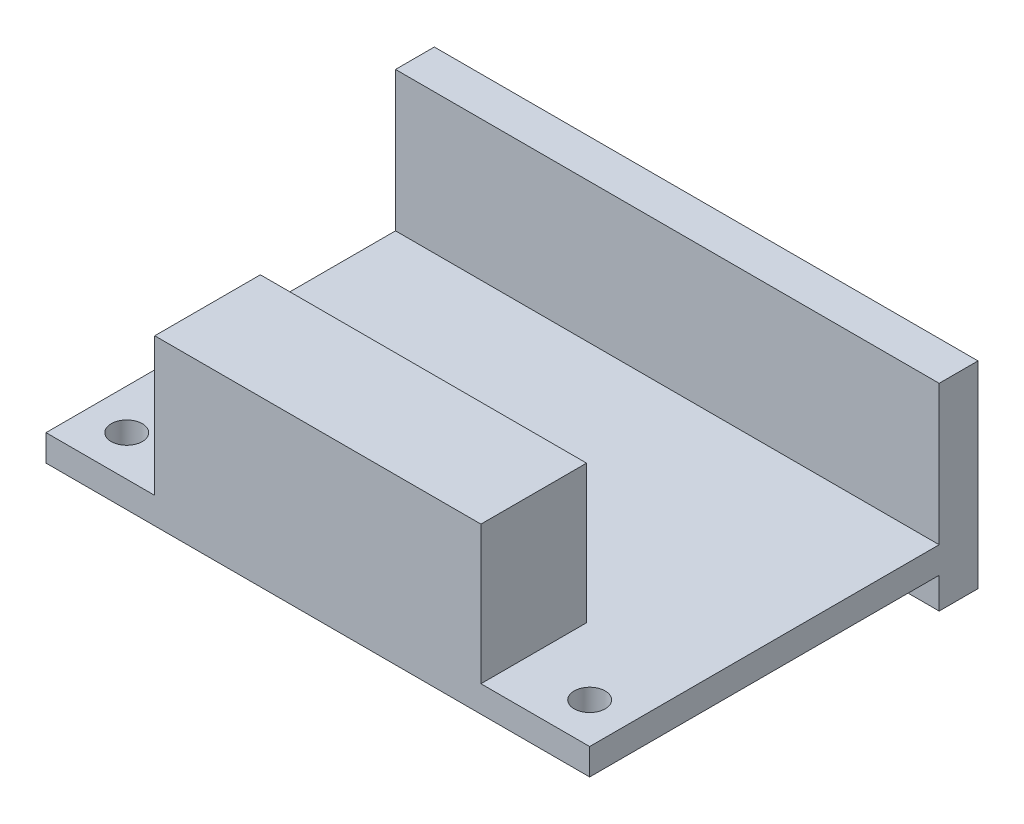
ISO-10303-21;
HEADER;
FILE_DESCRIPTION(('STEP AP214'),'2;1');
FILE_NAME('part.step','',(''),(''),'','','');
FILE_SCHEMA(('AUTOMOTIVE_DESIGN { 1 0 10303 214 1 1 1 1 }'));
ENDSEC;
DATA;
#1=APPLICATION_CONTEXT('core data for automotive mechanical design processes');
#2=APPLICATION_PROTOCOL_DEFINITION('international standard','automotive_design',2000,#1);
#3=PRODUCT_CONTEXT('',#1,'mechanical');
#4=PRODUCT('Part','Part','',(#3));
#5=PRODUCT_RELATED_PRODUCT_CATEGORY('part','',(#4));
#6=PRODUCT_DEFINITION_FORMATION('','',#4);
#7=PRODUCT_DEFINITION_CONTEXT('part definition',#1,'design');
#8=PRODUCT_DEFINITION('design','',#6,#7);
#9=PRODUCT_DEFINITION_SHAPE('','',#8);
#10=(LENGTH_UNIT() NAMED_UNIT(*) SI_UNIT(.MILLI.,.METRE.));
#11=(NAMED_UNIT(*) PLANE_ANGLE_UNIT() SI_UNIT($,.RADIAN.));
#12=(NAMED_UNIT(*) SI_UNIT($,.STERADIAN.) SOLID_ANGLE_UNIT());
#13=UNCERTAINTY_MEASURE_WITH_UNIT(LENGTH_MEASURE(1.E-05),#10,'distance_accuracy_value','');
#14=(GEOMETRIC_REPRESENTATION_CONTEXT(3) GLOBAL_UNCERTAINTY_ASSIGNED_CONTEXT((#13)) GLOBAL_UNIT_ASSIGNED_CONTEXT((#10,
#11,#12)) REPRESENTATION_CONTEXT('',''));
#15=CARTESIAN_POINT('',(0.,0.,0.));
#16=DIRECTION('',(0.,0.,1.));
#17=DIRECTION('',(1.,0.,0.));
#18=AXIS2_PLACEMENT_3D('',#15,#16,#17);
#19=CARTESIAN_POINT('',(0.,0.,0.));
#20=DIRECTION('',(0.,-1.,0.));
#21=DIRECTION('',(0.,0.,-1.));
#22=AXIS2_PLACEMENT_3D('',#19,#20,#21);
#23=PLANE('',#22);
#24=CARTESIAN_POINT('',(14.9,0.,9.9));
#25=DIRECTION('',(0.,-1.,0.));
#26=DIRECTION('',(0.,0.,-1.));
#27=AXIS2_PLACEMENT_3D('',#24,#25,#26);
#28=CIRCLE('',#27,1.);
#29=CARTESIAN_POINT('',(14.9,0.,8.9));
#30=VERTEX_POINT('',#29);
#31=EDGE_CURVE('E520',#30,#30,#28,.F.);
#32=ORIENTED_EDGE('',*,*,#31,.T.);
#33=EDGE_LOOP('',(#32));
#34=FACE_BOUND('',#33,.T.);
#35=CARTESIAN_POINT('',(-14.9,0.,9.9));
#36=DIRECTION('',(0.,-1.,0.));
#37=DIRECTION('',(0.,0.,-1.));
#38=AXIS2_PLACEMENT_3D('',#35,#36,#37);
#39=CIRCLE('',#38,1.);
#40=CARTESIAN_POINT('',(-14.9,0.,8.9));
#41=VERTEX_POINT('',#40);
#42=EDGE_CURVE('E528',#41,#41,#39,.F.);
#43=ORIENTED_EDGE('',*,*,#42,.T.);
#44=EDGE_LOOP('',(#43));
#45=FACE_BOUND('',#44,.T.);
#46=DIRECTION('',(-1.,0.,0.));
#47=VECTOR('',#46,1.);
#48=CARTESIAN_POINT('',(-17.5,0.,-10.));
#49=LINE('',#48,#47);
#50=CARTESIAN_POINT('',(17.5,0.,-10.));
#51=VERTEX_POINT('',#50);
#52=CARTESIAN_POINT('',(-17.5,0.,-10.));
#53=VERTEX_POINT('',#52);
#54=EDGE_CURVE('E55',#51,#53,#49,.T.);
#55=ORIENTED_EDGE('',*,*,#54,.F.);
#56=DIRECTION('',(0.,0.,-1.));
#57=VECTOR('',#56,1.);
#58=CARTESIAN_POINT('',(17.5,0.,12.5));
#59=LINE('',#58,#57);
#60=CARTESIAN_POINT('',(17.5,0.,12.5));
#61=VERTEX_POINT('',#60);
#62=EDGE_CURVE('E241',#61,#51,#59,.T.);
#63=ORIENTED_EDGE('',*,*,#62,.F.);
#64=DIRECTION('',(1.,0.,0.));
#65=VECTOR('',#64,1.);
#66=CARTESIAN_POINT('',(-17.5,0.,12.5));
#67=LINE('',#66,#65);
#68=CARTESIAN_POINT('',(-17.5,0.,12.5));
#69=VERTEX_POINT('',#68);
#70=EDGE_CURVE('E245',#69,#61,#67,.T.);
#71=ORIENTED_EDGE('',*,*,#70,.F.);
#72=DIRECTION('',(0.,0.,1.));
#73=VECTOR('',#72,1.);
#74=CARTESIAN_POINT('',(-17.5,0.,12.5));
#75=LINE('',#74,#73);
#76=EDGE_CURVE('E252',#53,#69,#75,.T.);
#77=ORIENTED_EDGE('',*,*,#76,.F.);
#78=EDGE_LOOP('',(#55,#63,#71,#77));
#79=FACE_BOUND('',#78,.T.);
#80=DIRECTION('',(1.,0.,0.));
#81=VECTOR('',#80,1.);
#82=CARTESIAN_POINT('',(-9.75,0.,7.));
#83=LINE('',#82,#81);
#84=CARTESIAN_POINT('',(-9.75,0.,7.));
#85=VERTEX_POINT('',#84);
#86=CARTESIAN_POINT('',(9.75,0.,7.));
#87=VERTEX_POINT('',#86);
#88=EDGE_CURVE('E509',#85,#87,#83,.T.);
#89=ORIENTED_EDGE('',*,*,#88,.F.);
#90=DIRECTION('',(0.,0.,-1.));
#91=VECTOR('',#90,1.);
#92=CARTESIAN_POINT('',(-9.75,0.,9.5));
#93=LINE('',#92,#91);
#94=CARTESIAN_POINT('',(-9.75,0.,9.5));
#95=VERTEX_POINT('',#94);
#96=EDGE_CURVE('E168',#95,#85,#93,.T.);
#97=ORIENTED_EDGE('',*,*,#96,.F.);
#98=DIRECTION('',(-1.,0.,0.));
#99=VECTOR('',#98,1.);
#100=CARTESIAN_POINT('',(-9.75,0.,9.5));
#101=LINE('',#100,#99);
#102=CARTESIAN_POINT('',(9.75,0.,9.5));
#103=VERTEX_POINT('',#102);
#104=EDGE_CURVE('E164',#103,#95,#101,.T.);
#105=ORIENTED_EDGE('',*,*,#104,.F.);
#106=DIRECTION('',(0.,0.,1.));
#107=VECTOR('',#106,1.);
#108=CARTESIAN_POINT('',(9.75,0.,9.5));
#109=LINE('',#108,#107);
#110=EDGE_CURVE('E507',#87,#103,#109,.T.);
#111=ORIENTED_EDGE('',*,*,#110,.F.);
#112=EDGE_LOOP('',(#89,#97,#105,#111));
#113=FACE_BOUND('',#112,.T.);
#114=ADVANCED_FACE('F32',(#34,#45,#79,#113),#23,.T.);
#115=CARTESIAN_POINT('',(0.,1.7,0.));
#116=DIRECTION('',(0.,-1.,0.));
#117=DIRECTION('',(0.,0.,-1.));
#118=AXIS2_PLACEMENT_3D('',#115,#116,#117);
#119=PLANE('',#118);
#120=CARTESIAN_POINT('',(14.9,1.7,9.9));
#121=DIRECTION('',(0.,1.,0.));
#122=DIRECTION('',(0.,0.,1.));
#123=AXIS2_PLACEMENT_3D('',#120,#121,#122);
#124=CIRCLE('',#123,1.);
#125=CARTESIAN_POINT('',(14.9,1.7,10.9));
#126=VERTEX_POINT('',#125);
#127=EDGE_CURVE('E518',#126,#126,#124,.T.);
#128=ORIENTED_EDGE('',*,*,#127,.F.);
#129=EDGE_LOOP('',(#128));
#130=FACE_BOUND('',#129,.T.);
#131=CARTESIAN_POINT('',(-14.9,1.7,9.9));
#132=DIRECTION('',(0.,1.,0.));
#133=DIRECTION('',(0.,0.,1.));
#134=AXIS2_PLACEMENT_3D('',#131,#132,#133);
#135=CIRCLE('',#134,1.);
#136=CARTESIAN_POINT('',(-14.9,1.7,10.9));
#137=VERTEX_POINT('',#136);
#138=EDGE_CURVE('E523',#137,#137,#135,.T.);
#139=ORIENTED_EDGE('',*,*,#138,.F.);
#140=EDGE_LOOP('',(#139));
#141=FACE_BOUND('',#140,.T.);
#142=DIRECTION('',(1.,0.,0.));
#143=VECTOR('',#142,1.);
#144=CARTESIAN_POINT('',(-17.5,1.7,-10.));
#145=LINE('',#144,#143);
#146=CARTESIAN_POINT('',(-17.5,1.7,-10.));
#147=VERTEX_POINT('',#146);
#148=CARTESIAN_POINT('',(17.5,1.7,-10.));
#149=VERTEX_POINT('',#148);
#150=EDGE_CURVE('E191',#147,#149,#145,.T.);
#151=ORIENTED_EDGE('',*,*,#150,.F.);
#152=DIRECTION('',(0.,0.,1.));
#153=VECTOR('',#152,1.);
#154=CARTESIAN_POINT('',(-17.5,1.7,12.5));
#155=LINE('',#154,#153);
#156=CARTESIAN_POINT('',(-17.5,1.7,12.5));
#157=VERTEX_POINT('',#156);
#158=EDGE_CURVE('E244',#147,#157,#155,.T.);
#159=ORIENTED_EDGE('',*,*,#158,.T.);
#160=DIRECTION('',(1.,0.,0.));
#161=VECTOR('',#160,1.);
#162=CARTESIAN_POINT('',(-17.5,1.7,12.5));
#163=LINE('',#162,#161);
#164=CARTESIAN_POINT('',(-10.5,1.7,12.5));
#165=VERTEX_POINT('',#164);
#166=EDGE_CURVE('E248',#157,#165,#163,.T.);
#167=ORIENTED_EDGE('',*,*,#166,.T.);
#168=DIRECTION('',(0.,0.,1.));
#169=VECTOR('',#168,1.);
#170=CARTESIAN_POINT('',(-10.5,1.7,12.5));
#171=LINE('',#170,#169);
#172=CARTESIAN_POINT('',(-10.5,1.7,5.7));
#173=VERTEX_POINT('',#172);
#174=EDGE_CURVE('E216',#173,#165,#171,.T.);
#175=ORIENTED_EDGE('',*,*,#174,.F.);
#176=DIRECTION('',(-1.,0.,0.));
#177=VECTOR('',#176,1.);
#178=CARTESIAN_POINT('',(10.5,1.7,5.7));
#179=LINE('',#178,#177);
#180=CARTESIAN_POINT('',(10.5,1.7,5.7));
#181=VERTEX_POINT('',#180);
#182=EDGE_CURVE('E225',#181,#173,#179,.T.);
#183=ORIENTED_EDGE('',*,*,#182,.F.);
#184=DIRECTION('',(0.,0.,-1.));
#185=VECTOR('',#184,1.);
#186=CARTESIAN_POINT('',(10.5,1.7,12.5));
#187=LINE('',#186,#185);
#188=CARTESIAN_POINT('',(10.5,1.7,12.5));
#189=VERTEX_POINT('',#188);
#190=EDGE_CURVE('E211',#189,#181,#187,.T.);
#191=ORIENTED_EDGE('',*,*,#190,.F.);
#192=CARTESIAN_POINT('',(17.5,1.7,12.5));
#193=VERTEX_POINT('',#192);
#194=EDGE_CURVE('E247',#189,#193,#163,.T.);
#195=ORIENTED_EDGE('',*,*,#194,.T.);
#196=DIRECTION('',(0.,0.,-1.));
#197=VECTOR('',#196,1.);
#198=CARTESIAN_POINT('',(17.5,1.7,12.5));
#199=LINE('',#198,#197);
#200=EDGE_CURVE('E242',#193,#149,#199,.T.);
#201=ORIENTED_EDGE('',*,*,#200,.T.);
#202=EDGE_LOOP('',(#151,#159,#167,#175,#183,#191,#195,#201));
#203=FACE_BOUND('',#202,.T.);
#204=ADVANCED_FACE('F301',(#130,#141,#203),#119,.F.);
#205=CARTESIAN_POINT('',(17.5,1.7,12.5));
#206=DIRECTION('',(-1.,0.,0.));
#207=DIRECTION('',(0.,0.,1.));
#208=AXIS2_PLACEMENT_3D('',#205,#206,#207);
#209=PLANE('',#208);
#210=ORIENTED_EDGE('',*,*,#62,.T.);
#211=DIRECTION('',(0.,1.,0.));
#212=VECTOR('',#211,1.);
#213=CARTESIAN_POINT('',(17.5,-2.,-10.));
#214=LINE('',#213,#212);
#215=CARTESIAN_POINT('',(17.5,-2.,-10.));
#216=VERTEX_POINT('',#215);
#217=EDGE_CURVE('E188',#216,#51,#214,.T.);
#218=ORIENTED_EDGE('',*,*,#217,.F.);
#219=DIRECTION('',(0.,0.,1.));
#220=VECTOR('',#219,1.);
#221=CARTESIAN_POINT('',(17.5,-2.,-12.5));
#222=LINE('',#221,#220);
#223=CARTESIAN_POINT('',(17.5,-2.,-12.5));
#224=VERTEX_POINT('',#223);
#225=EDGE_CURVE('E181',#224,#216,#222,.T.);
#226=ORIENTED_EDGE('',*,*,#225,.F.);
#227=DIRECTION('',(0.,-1.,0.));
#228=VECTOR('',#227,1.);
#229=CARTESIAN_POINT('',(17.5,1.7,-12.5));
#230=LINE('',#229,#228);
#231=CARTESIAN_POINT('',(17.5,10.7,-12.5));
#232=VERTEX_POINT('',#231);
#233=EDGE_CURVE('E11',#232,#224,#230,.T.);
#234=ORIENTED_EDGE('',*,*,#233,.F.);
#235=DIRECTION('',(0.,0.,-1.));
#236=VECTOR('',#235,1.);
#237=CARTESIAN_POINT('',(17.5,10.7,-12.5));
#238=LINE('',#237,#236);
#239=CARTESIAN_POINT('',(17.5,10.7,-10.));
#240=VERTEX_POINT('',#239);
#241=EDGE_CURVE('E197',#240,#232,#238,.T.);
#242=ORIENTED_EDGE('',*,*,#241,.F.);
#243=DIRECTION('',(0.,-1.,0.));
#244=VECTOR('',#243,1.);
#245=CARTESIAN_POINT('',(17.5,10.7,-10.));
#246=LINE('',#245,#244);
#247=EDGE_CURVE('E203',#240,#149,#246,.T.);
#248=ORIENTED_EDGE('',*,*,#247,.T.);
#249=ORIENTED_EDGE('',*,*,#200,.F.);
#250=DIRECTION('',(0.,-1.,0.));
#251=VECTOR('',#250,1.);
#252=CARTESIAN_POINT('',(17.5,1.7,12.5));
#253=LINE('',#252,#251);
#254=EDGE_CURVE('E250',#193,#61,#253,.T.);
#255=ORIENTED_EDGE('',*,*,#254,.T.);
#256=EDGE_LOOP('',(#210,#218,#226,#234,#242,#248,#249,#255));
#257=FACE_BOUND('',#256,.T.);
#258=ADVANCED_FACE('F34',(#257),#209,.F.);
#259=CARTESIAN_POINT('',(-17.5,1.7,-12.5));
#260=DIRECTION('',(0.,0.,1.));
#261=DIRECTION('',(1.,0.,0.));
#262=AXIS2_PLACEMENT_3D('',#259,#260,#261);
#263=PLANE('',#262);
#264=ORIENTED_EDGE('',*,*,#233,.T.);
#265=DIRECTION('',(1.,0.,0.));
#266=VECTOR('',#265,1.);
#267=CARTESIAN_POINT('',(-17.5,-2.,-12.5));
#268=LINE('',#267,#266);
#269=CARTESIAN_POINT('',(-17.5,-2.,-12.5));
#270=VERTEX_POINT('',#269);
#271=EDGE_CURVE('E178',#270,#224,#268,.T.);
#272=ORIENTED_EDGE('',*,*,#271,.F.);
#273=DIRECTION('',(0.,-1.,0.));
#274=VECTOR('',#273,1.);
#275=CARTESIAN_POINT('',(-17.5,1.7,-12.5));
#276=LINE('',#275,#274);
#277=CARTESIAN_POINT('',(-17.5,10.7,-12.5));
#278=VERTEX_POINT('',#277);
#279=EDGE_CURVE('E40',#278,#270,#276,.T.);
#280=ORIENTED_EDGE('',*,*,#279,.F.);
#281=DIRECTION('',(-1.,0.,0.));
#282=VECTOR('',#281,1.);
#283=CARTESIAN_POINT('',(-17.5,10.7,-12.5));
#284=LINE('',#283,#282);
#285=EDGE_CURVE('E200',#232,#278,#284,.T.);
#286=ORIENTED_EDGE('',*,*,#285,.F.);
#287=EDGE_LOOP('',(#264,#272,#280,#286));
#288=FACE_BOUND('',#287,.T.);
#289=ADVANCED_FACE('F267',(#288),#263,.F.);
#290=CARTESIAN_POINT('',(-17.5,1.7,12.5));
#291=DIRECTION('',(1.,0.,0.));
#292=DIRECTION('',(0.,0.,-1.));
#293=AXIS2_PLACEMENT_3D('',#290,#291,#292);
#294=PLANE('',#293);
#295=ORIENTED_EDGE('',*,*,#279,.T.);
#296=DIRECTION('',(0.,0.,-1.));
#297=VECTOR('',#296,1.);
#298=CARTESIAN_POINT('',(-17.5,-2.,-12.5));
#299=LINE('',#298,#297);
#300=CARTESIAN_POINT('',(-17.5,-2.,-10.));
#301=VERTEX_POINT('',#300);
#302=EDGE_CURVE('E171',#301,#270,#299,.T.);
#303=ORIENTED_EDGE('',*,*,#302,.F.);
#304=DIRECTION('',(0.,1.,0.));
#305=VECTOR('',#304,1.);
#306=CARTESIAN_POINT('',(-17.5,-2.,-10.));
#307=LINE('',#306,#305);
#308=EDGE_CURVE('E184',#301,#53,#307,.T.);
#309=ORIENTED_EDGE('',*,*,#308,.T.);
#310=ORIENTED_EDGE('',*,*,#76,.T.);
#311=DIRECTION('',(0.,-1.,0.));
#312=VECTOR('',#311,1.);
#313=CARTESIAN_POINT('',(-17.5,1.7,12.5));
#314=LINE('',#313,#312);
#315=EDGE_CURVE('E257',#157,#69,#314,.T.);
#316=ORIENTED_EDGE('',*,*,#315,.F.);
#317=ORIENTED_EDGE('',*,*,#158,.F.);
#318=DIRECTION('',(0.,-1.,0.));
#319=VECTOR('',#318,1.);
#320=CARTESIAN_POINT('',(-17.5,10.7,-10.));
#321=LINE('',#320,#319);
#322=CARTESIAN_POINT('',(-17.5,10.7,-10.));
#323=VERTEX_POINT('',#322);
#324=EDGE_CURVE('E208',#323,#147,#321,.T.);
#325=ORIENTED_EDGE('',*,*,#324,.F.);
#326=DIRECTION('',(0.,0.,1.));
#327=VECTOR('',#326,1.);
#328=CARTESIAN_POINT('',(-17.5,10.7,-12.5));
#329=LINE('',#328,#327);
#330=EDGE_CURVE('E192',#278,#323,#329,.T.);
#331=ORIENTED_EDGE('',*,*,#330,.F.);
#332=EDGE_LOOP('',(#295,#303,#309,#310,#316,#317,#325,#331));
#333=FACE_BOUND('',#332,.T.);
#334=ADVANCED_FACE('F263',(#333),#294,.F.);
#335=CARTESIAN_POINT('',(-17.5,1.7,12.5));
#336=DIRECTION('',(0.,0.,-1.));
#337=DIRECTION('',(-1.,0.,0.));
#338=AXIS2_PLACEMENT_3D('',#335,#336,#337);
#339=PLANE('',#338);
#340=ORIENTED_EDGE('',*,*,#70,.T.);
#341=ORIENTED_EDGE('',*,*,#254,.F.);
#342=ORIENTED_EDGE('',*,*,#194,.F.);
#343=DIRECTION('',(0.,-1.,0.));
#344=VECTOR('',#343,1.);
#345=CARTESIAN_POINT('',(10.5,10.6,12.5));
#346=LINE('',#345,#344);
#347=CARTESIAN_POINT('',(10.5,10.6,12.5));
#348=VERTEX_POINT('',#347);
#349=EDGE_CURVE('E222',#348,#189,#346,.T.);
#350=ORIENTED_EDGE('',*,*,#349,.F.);
#351=DIRECTION('',(1.,0.,0.));
#352=VECTOR('',#351,1.);
#353=CARTESIAN_POINT('',(10.5,10.6,12.5));
#354=LINE('',#353,#352);
#355=CARTESIAN_POINT('',(-10.5,10.6,12.5));
#356=VERTEX_POINT('',#355);
#357=EDGE_CURVE('E220',#356,#348,#354,.T.);
#358=ORIENTED_EDGE('',*,*,#357,.F.);
#359=DIRECTION('',(0.,-1.,0.));
#360=VECTOR('',#359,1.);
#361=CARTESIAN_POINT('',(-10.5,10.6,12.5));
#362=LINE('',#361,#360);
#363=EDGE_CURVE('E232',#356,#165,#362,.T.);
#364=ORIENTED_EDGE('',*,*,#363,.T.);
#365=ORIENTED_EDGE('',*,*,#166,.F.);
#366=ORIENTED_EDGE('',*,*,#315,.T.);
#367=EDGE_LOOP('',(#340,#341,#342,#350,#358,#364,#365,#366));
#368=FACE_BOUND('',#367,.T.);
#369=ADVANCED_FACE('F280',(#368),#339,.F.);
#370=CARTESIAN_POINT('',(10.5,10.6,12.5));
#371=DIRECTION('',(-1.,0.,0.));
#372=DIRECTION('',(0.,0.,1.));
#373=AXIS2_PLACEMENT_3D('',#370,#371,#372);
#374=PLANE('',#373);
#375=ORIENTED_EDGE('',*,*,#190,.T.);
#376=DIRECTION('',(0.,-1.,0.));
#377=VECTOR('',#376,1.);
#378=CARTESIAN_POINT('',(10.5,10.6,5.7));
#379=LINE('',#378,#377);
#380=CARTESIAN_POINT('',(10.5,10.6,5.7));
#381=VERTEX_POINT('',#380);
#382=EDGE_CURVE('E238',#381,#181,#379,.T.);
#383=ORIENTED_EDGE('',*,*,#382,.F.);
#384=DIRECTION('',(0.,0.,-1.));
#385=VECTOR('',#384,1.);
#386=CARTESIAN_POINT('',(10.5,10.6,12.5));
#387=LINE('',#386,#385);
#388=EDGE_CURVE('E212',#348,#381,#387,.T.);
#389=ORIENTED_EDGE('',*,*,#388,.F.);
#390=ORIENTED_EDGE('',*,*,#349,.T.);
#391=EDGE_LOOP('',(#375,#383,#389,#390));
#392=FACE_BOUND('',#391,.T.);
#393=ADVANCED_FACE('F291',(#392),#374,.F.);
#394=CARTESIAN_POINT('',(10.5,10.6,5.7));
#395=DIRECTION('',(0.,0.,1.));
#396=DIRECTION('',(1.,0.,0.));
#397=AXIS2_PLACEMENT_3D('',#394,#395,#396);
#398=PLANE('',#397);
#399=ORIENTED_EDGE('',*,*,#182,.T.);
#400=DIRECTION('',(0.,-1.,0.));
#401=VECTOR('',#400,1.);
#402=CARTESIAN_POINT('',(-10.5,10.6,5.7));
#403=LINE('',#402,#401);
#404=CARTESIAN_POINT('',(-10.5,10.6,5.7));
#405=VERTEX_POINT('',#404);
#406=EDGE_CURVE('E235',#405,#173,#403,.T.);
#407=ORIENTED_EDGE('',*,*,#406,.F.);
#408=DIRECTION('',(-1.,0.,0.));
#409=VECTOR('',#408,1.);
#410=CARTESIAN_POINT('',(10.5,10.6,5.7));
#411=LINE('',#410,#409);
#412=EDGE_CURVE('E215',#381,#405,#411,.T.);
#413=ORIENTED_EDGE('',*,*,#412,.F.);
#414=ORIENTED_EDGE('',*,*,#382,.T.);
#415=EDGE_LOOP('',(#399,#407,#413,#414));
#416=FACE_BOUND('',#415,.T.);
#417=ADVANCED_FACE('F303',(#416),#398,.F.);
#418=CARTESIAN_POINT('',(-10.5,10.6,12.5));
#419=DIRECTION('',(1.,0.,0.));
#420=DIRECTION('',(0.,0.,-1.));
#421=AXIS2_PLACEMENT_3D('',#418,#419,#420);
#422=PLANE('',#421);
#423=ORIENTED_EDGE('',*,*,#174,.T.);
#424=ORIENTED_EDGE('',*,*,#363,.F.);
#425=DIRECTION('',(0.,0.,1.));
#426=VECTOR('',#425,1.);
#427=CARTESIAN_POINT('',(-10.5,10.6,12.5));
#428=LINE('',#427,#426);
#429=EDGE_CURVE('E218',#405,#356,#428,.T.);
#430=ORIENTED_EDGE('',*,*,#429,.F.);
#431=ORIENTED_EDGE('',*,*,#406,.T.);
#432=EDGE_LOOP('',(#423,#424,#430,#431));
#433=FACE_BOUND('',#432,.T.);
#434=ADVANCED_FACE('F299',(#433),#422,.F.);
#435=CARTESIAN_POINT('',(0.,10.6,0.));
#436=DIRECTION('',(0.,1.,0.));
#437=DIRECTION('',(0.,0.,1.));
#438=AXIS2_PLACEMENT_3D('',#435,#436,#437);
#439=PLANE('',#438);
#440=ORIENTED_EDGE('',*,*,#388,.T.);
#441=ORIENTED_EDGE('',*,*,#412,.T.);
#442=ORIENTED_EDGE('',*,*,#429,.T.);
#443=ORIENTED_EDGE('',*,*,#357,.T.);
#444=EDGE_LOOP('',(#440,#441,#442,#443));
#445=FACE_BOUND('',#444,.T.);
#446=ADVANCED_FACE('F294',(#445),#439,.T.);
#447=CARTESIAN_POINT('',(-17.5,10.7,-10.));
#448=DIRECTION('',(0.,0.,-1.));
#449=DIRECTION('',(-1.,0.,0.));
#450=AXIS2_PLACEMENT_3D('',#447,#448,#449);
#451=PLANE('',#450);
#452=ORIENTED_EDGE('',*,*,#150,.T.);
#453=ORIENTED_EDGE('',*,*,#247,.F.);
#454=DIRECTION('',(1.,0.,0.));
#455=VECTOR('',#454,1.);
#456=CARTESIAN_POINT('',(-17.5,10.7,-10.));
#457=LINE('',#456,#455);
#458=EDGE_CURVE('E195',#323,#240,#457,.T.);
#459=ORIENTED_EDGE('',*,*,#458,.F.);
#460=ORIENTED_EDGE('',*,*,#324,.T.);
#461=EDGE_LOOP('',(#452,#453,#459,#460));
#462=FACE_BOUND('',#461,.T.);
#463=ADVANCED_FACE('F345',(#462),#451,.F.);
#464=CARTESIAN_POINT('',(0.,10.7,0.));
#465=DIRECTION('',(0.,1.,0.));
#466=DIRECTION('',(0.,0.,1.));
#467=AXIS2_PLACEMENT_3D('',#464,#465,#466);
#468=PLANE('',#467);
#469=ORIENTED_EDGE('',*,*,#330,.T.);
#470=ORIENTED_EDGE('',*,*,#458,.T.);
#471=ORIENTED_EDGE('',*,*,#241,.T.);
#472=ORIENTED_EDGE('',*,*,#285,.T.);
#473=EDGE_LOOP('',(#469,#470,#471,#472));
#474=FACE_BOUND('',#473,.T.);
#475=ADVANCED_FACE('F342',(#474),#468,.T.);
#476=CARTESIAN_POINT('',(-17.5,-2.,-10.));
#477=DIRECTION('',(0.,0.,-1.));
#478=DIRECTION('',(-1.,0.,0.));
#479=AXIS2_PLACEMENT_3D('',#476,#477,#478);
#480=PLANE('',#479);
#481=ORIENTED_EDGE('',*,*,#54,.T.);
#482=ORIENTED_EDGE('',*,*,#308,.F.);
#483=DIRECTION('',(-1.,0.,0.));
#484=VECTOR('',#483,1.);
#485=CARTESIAN_POINT('',(-17.5,-2.,-10.));
#486=LINE('',#485,#484);
#487=EDGE_CURVE('E183',#216,#301,#486,.T.);
#488=ORIENTED_EDGE('',*,*,#487,.F.);
#489=ORIENTED_EDGE('',*,*,#217,.T.);
#490=EDGE_LOOP('',(#481,#482,#488,#489));
#491=FACE_BOUND('',#490,.T.);
#492=ADVANCED_FACE('F275',(#491),#480,.F.);
#493=CARTESIAN_POINT('',(0.,-2.,0.));
#494=DIRECTION('',(0.,1.,0.));
#495=DIRECTION('',(0.,0.,1.));
#496=AXIS2_PLACEMENT_3D('',#493,#494,#495);
#497=PLANE('',#496);
#498=ORIENTED_EDGE('',*,*,#302,.T.);
#499=ORIENTED_EDGE('',*,*,#271,.T.);
#500=ORIENTED_EDGE('',*,*,#225,.T.);
#501=ORIENTED_EDGE('',*,*,#487,.T.);
#502=EDGE_LOOP('',(#498,#499,#500,#501));
#503=FACE_BOUND('',#502,.T.);
#504=ADVANCED_FACE('F270',(#503),#497,.F.);
#505=CARTESIAN_POINT('',(-9.75,-2.,9.5));
#506=DIRECTION('',(1.,0.,0.));
#507=DIRECTION('',(0.,0.,-1.));
#508=AXIS2_PLACEMENT_3D('',#505,#506,#507);
#509=PLANE('',#508);
#510=ORIENTED_EDGE('',*,*,#96,.T.);
#511=DIRECTION('',(0.,1.,0.));
#512=VECTOR('',#511,1.);
#513=CARTESIAN_POINT('',(-9.75,-2.,7.));
#514=LINE('',#513,#512);
#515=CARTESIAN_POINT('',(-9.75,-2.,7.));
#516=VERTEX_POINT('',#515);
#517=EDGE_CURVE('E149',#516,#85,#514,.T.);
#518=ORIENTED_EDGE('',*,*,#517,.F.);
#519=DIRECTION('',(0.,0.,-1.));
#520=VECTOR('',#519,1.);
#521=CARTESIAN_POINT('',(-9.75,-2.,9.5));
#522=LINE('',#521,#520);
#523=CARTESIAN_POINT('',(-9.75,-2.,9.5));
#524=VERTEX_POINT('',#523);
#525=EDGE_CURVE('E156',#524,#516,#522,.T.);
#526=ORIENTED_EDGE('',*,*,#525,.F.);
#527=DIRECTION('',(0.,1.,0.));
#528=VECTOR('',#527,1.);
#529=CARTESIAN_POINT('',(-9.75,-2.,9.5));
#530=LINE('',#529,#528);
#531=EDGE_CURVE('E514',#524,#95,#530,.T.);
#532=ORIENTED_EDGE('',*,*,#531,.T.);
#533=EDGE_LOOP('',(#510,#518,#526,#532));
#534=FACE_BOUND('',#533,.T.);
#535=ADVANCED_FACE('F166',(#534),#509,.F.);
#536=CARTESIAN_POINT('',(-9.75,-2.,7.));
#537=DIRECTION('',(0.,0.,1.));
#538=DIRECTION('',(1.,0.,0.));
#539=AXIS2_PLACEMENT_3D('',#536,#537,#538);
#540=PLANE('',#539);
#541=ORIENTED_EDGE('',*,*,#88,.T.);
#542=DIRECTION('',(0.,1.,0.));
#543=VECTOR('',#542,1.);
#544=CARTESIAN_POINT('',(9.75,-2.,7.));
#545=LINE('',#544,#543);
#546=CARTESIAN_POINT('',(9.75,-2.,7.));
#547=VERTEX_POINT('',#546);
#548=EDGE_CURVE('E152',#547,#87,#545,.T.);
#549=ORIENTED_EDGE('',*,*,#548,.F.);
#550=DIRECTION('',(1.,0.,0.));
#551=VECTOR('',#550,1.);
#552=CARTESIAN_POINT('',(-9.75,-2.,7.));
#553=LINE('',#552,#551);
#554=EDGE_CURVE('E145',#516,#547,#553,.T.);
#555=ORIENTED_EDGE('',*,*,#554,.F.);
#556=ORIENTED_EDGE('',*,*,#517,.T.);
#557=EDGE_LOOP('',(#541,#549,#555,#556));
#558=FACE_BOUND('',#557,.T.);
#559=ADVANCED_FACE('F147',(#558),#540,.F.);
#560=CARTESIAN_POINT('',(9.75,-2.,9.5));
#561=DIRECTION('',(-1.,0.,0.));
#562=DIRECTION('',(0.,0.,1.));
#563=AXIS2_PLACEMENT_3D('',#560,#561,#562);
#564=PLANE('',#563);
#565=ORIENTED_EDGE('',*,*,#110,.T.);
#566=DIRECTION('',(0.,1.,0.));
#567=VECTOR('',#566,1.);
#568=CARTESIAN_POINT('',(9.75,-2.,9.5));
#569=LINE('',#568,#567);
#570=CARTESIAN_POINT('',(9.75,-2.,9.5));
#571=VERTEX_POINT('',#570);
#572=EDGE_CURVE('E47',#571,#103,#569,.T.);
#573=ORIENTED_EDGE('',*,*,#572,.F.);
#574=DIRECTION('',(0.,0.,1.));
#575=VECTOR('',#574,1.);
#576=CARTESIAN_POINT('',(9.75,-2.,9.5));
#577=LINE('',#576,#575);
#578=EDGE_CURVE('E155',#547,#571,#577,.T.);
#579=ORIENTED_EDGE('',*,*,#578,.F.);
#580=ORIENTED_EDGE('',*,*,#548,.T.);
#581=EDGE_LOOP('',(#565,#573,#579,#580));
#582=FACE_BOUND('',#581,.T.);
#583=ADVANCED_FACE('F420',(#582),#564,.F.);
#584=CARTESIAN_POINT('',(-9.75,-2.,9.5));
#585=DIRECTION('',(0.,0.,-1.));
#586=DIRECTION('',(-1.,0.,0.));
#587=AXIS2_PLACEMENT_3D('',#584,#585,#586);
#588=PLANE('',#587);
#589=ORIENTED_EDGE('',*,*,#104,.T.);
#590=ORIENTED_EDGE('',*,*,#531,.F.);
#591=DIRECTION('',(-1.,0.,0.));
#592=VECTOR('',#591,1.);
#593=CARTESIAN_POINT('',(-9.75,-2.,9.5));
#594=LINE('',#593,#592);
#595=EDGE_CURVE('E160',#571,#524,#594,.T.);
#596=ORIENTED_EDGE('',*,*,#595,.F.);
#597=ORIENTED_EDGE('',*,*,#572,.T.);
#598=EDGE_LOOP('',(#589,#590,#596,#597));
#599=FACE_BOUND('',#598,.T.);
#600=ADVANCED_FACE('F417',(#599),#588,.F.);
#601=CARTESIAN_POINT('',(0.,-2.,0.));
#602=DIRECTION('',(0.,-1.,0.));
#603=DIRECTION('',(0.,0.,-1.));
#604=AXIS2_PLACEMENT_3D('',#601,#602,#603);
#605=PLANE('',#604);
#606=ORIENTED_EDGE('',*,*,#525,.T.);
#607=ORIENTED_EDGE('',*,*,#554,.T.);
#608=ORIENTED_EDGE('',*,*,#578,.T.);
#609=ORIENTED_EDGE('',*,*,#595,.T.);
#610=EDGE_LOOP('',(#606,#607,#608,#609));
#611=FACE_BOUND('',#610,.T.);
#612=ADVANCED_FACE('F159',(#611),#605,.T.);
#613=CARTESIAN_POINT('',(-14.9,-2.001,9.9));
#614=DIRECTION('',(0.,1.,0.));
#615=DIRECTION('',(0.,0.,1.));
#616=AXIS2_PLACEMENT_3D('',#613,#614,#615);
#617=CYLINDRICAL_SURFACE('',#616,1.);
#618=ORIENTED_EDGE('',*,*,#42,.F.);
#619=EDGE_LOOP('',(#618));
#620=FACE_BOUND('',#619,.T.);
#621=ORIENTED_EDGE('',*,*,#138,.T.);
#622=EDGE_LOOP('',(#621));
#623=FACE_BOUND('',#622,.T.);
#624=ADVANCED_FACE('F392',(#620,#623),#617,.F.);
#625=CARTESIAN_POINT('',(14.9,-2.001,9.9));
#626=DIRECTION('',(0.,1.,0.));
#627=DIRECTION('',(0.,0.,1.));
#628=AXIS2_PLACEMENT_3D('',#625,#626,#627);
#629=CYLINDRICAL_SURFACE('',#628,1.);
#630=ORIENTED_EDGE('',*,*,#31,.F.);
#631=EDGE_LOOP('',(#630));
#632=FACE_BOUND('',#631,.T.);
#633=ORIENTED_EDGE('',*,*,#127,.T.);
#634=EDGE_LOOP('',(#633));
#635=FACE_BOUND('',#634,.T.);
#636=ADVANCED_FACE('F397',(#632,#635),#629,.F.);
#637=CLOSED_SHELL('',(#114,#204,#258,#289,#334,#369,#393,#417,#434,#446,#463,#475,#492,#504,
#535,#559,#583,#600,#612,#624,#636));
#638=MANIFOLD_SOLID_BREP('B2',#637);
#639=ADVANCED_BREP_SHAPE_REPRESENTATION('',(#18,#638),#14);
#640=SHAPE_DEFINITION_REPRESENTATION(#9,#639);
ENDSEC;
END-ISO-10303-21;
